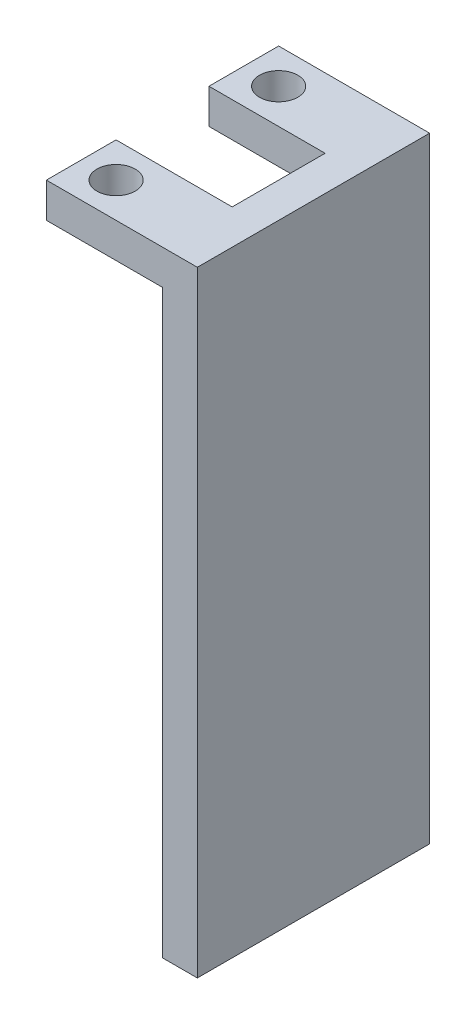
ISO-10303-21;
HEADER;
FILE_DESCRIPTION(('STEP AP214'),'2;1');
FILE_NAME('part.step','',(''),(''),'','','');
FILE_SCHEMA(('AUTOMOTIVE_DESIGN { 1 0 10303 214 1 1 1 1 }'));
ENDSEC;
DATA;
#1=APPLICATION_CONTEXT('core data for automotive mechanical design processes');
#2=APPLICATION_PROTOCOL_DEFINITION('international standard','automotive_design',2000,#1);
#3=PRODUCT_CONTEXT('',#1,'mechanical');
#4=PRODUCT('Part','Part','',(#3));
#5=PRODUCT_RELATED_PRODUCT_CATEGORY('part','',(#4));
#6=PRODUCT_DEFINITION_FORMATION('','',#4);
#7=PRODUCT_DEFINITION_CONTEXT('part definition',#1,'design');
#8=PRODUCT_DEFINITION('design','',#6,#7);
#9=PRODUCT_DEFINITION_SHAPE('','',#8);
#10=(LENGTH_UNIT() NAMED_UNIT(*) SI_UNIT(.MILLI.,.METRE.));
#11=(NAMED_UNIT(*) PLANE_ANGLE_UNIT() SI_UNIT($,.RADIAN.));
#12=(NAMED_UNIT(*) SI_UNIT($,.STERADIAN.) SOLID_ANGLE_UNIT());
#13=UNCERTAINTY_MEASURE_WITH_UNIT(LENGTH_MEASURE(1.E-05),#10,'distance_accuracy_value','');
#14=(GEOMETRIC_REPRESENTATION_CONTEXT(3) GLOBAL_UNCERTAINTY_ASSIGNED_CONTEXT((#13)) GLOBAL_UNIT_ASSIGNED_CONTEXT((#10,
#11,#12)) REPRESENTATION_CONTEXT('',''));
#15=CARTESIAN_POINT('',(0.,0.,0.));
#16=DIRECTION('',(0.,0.,1.));
#17=DIRECTION('',(1.,0.,0.));
#18=AXIS2_PLACEMENT_3D('',#15,#16,#17);
#19=CARTESIAN_POINT('',(0.,0.,0.));
#20=DIRECTION('',(1.,0.,0.));
#21=DIRECTION('',(0.,0.,-1.));
#22=AXIS2_PLACEMENT_3D('',#19,#20,#21);
#23=PLANE('',#22);
#24=DIRECTION('',(0.,-1.,0.));
#25=VECTOR('',#24,1.);
#26=CARTESIAN_POINT('',(0.,0.,4.));
#27=LINE('',#26,#25);
#28=CARTESIAN_POINT('',(0.,26.5,4.));
#29=VERTEX_POINT('',#28);
#30=CARTESIAN_POINT('',(0.,23.5,4.));
#31=VERTEX_POINT('',#30);
#32=EDGE_CURVE('E205',#29,#31,#27,.T.);
#33=ORIENTED_EDGE('',*,*,#32,.F.);
#34=DIRECTION('',(0.,0.,-1.));
#35=VECTOR('',#34,1.);
#36=CARTESIAN_POINT('',(0.,26.5,10.));
#37=LINE('',#36,#35);
#38=CARTESIAN_POINT('',(0.,26.5,-4.));
#39=VERTEX_POINT('',#38);
#40=EDGE_CURVE('E137',#29,#39,#37,.T.);
#41=ORIENTED_EDGE('',*,*,#40,.T.);
#42=DIRECTION('',(0.,-1.,0.));
#43=VECTOR('',#42,1.);
#44=CARTESIAN_POINT('',(0.,0.,-4.));
#45=LINE('',#44,#43);
#46=CARTESIAN_POINT('',(0.,23.5,-4.));
#47=VERTEX_POINT('',#46);
#48=EDGE_CURVE('E138',#39,#47,#45,.T.);
#49=ORIENTED_EDGE('',*,*,#48,.T.);
#50=DIRECTION('',(0.,0.,1.));
#51=VECTOR('',#50,1.);
#52=CARTESIAN_POINT('',(0.,23.5,0.));
#53=LINE('',#52,#51);
#54=CARTESIAN_POINT('',(0.,23.5,-10.));
#55=VERTEX_POINT('',#54);
#56=EDGE_CURVE('E140',#55,#47,#53,.T.);
#57=ORIENTED_EDGE('',*,*,#56,.F.);
#58=DIRECTION('',(0.,1.,0.));
#59=VECTOR('',#58,1.);
#60=CARTESIAN_POINT('',(0.,-26.5,-10.));
#61=LINE('',#60,#59);
#62=CARTESIAN_POINT('',(0.,-26.5,-10.));
#63=VERTEX_POINT('',#62);
#64=EDGE_CURVE('E181',#63,#55,#61,.T.);
#65=ORIENTED_EDGE('',*,*,#64,.F.);
#66=DIRECTION('',(0.,0.,-1.));
#67=VECTOR('',#66,1.);
#68=CARTESIAN_POINT('',(0.,-26.5,10.));
#69=LINE('',#68,#67);
#70=CARTESIAN_POINT('',(0.,-26.5,10.));
#71=VERTEX_POINT('',#70);
#72=EDGE_CURVE('E166',#71,#63,#69,.T.);
#73=ORIENTED_EDGE('',*,*,#72,.F.);
#74=DIRECTION('',(0.,1.,0.));
#75=VECTOR('',#74,1.);
#76=CARTESIAN_POINT('',(0.,-26.5,10.));
#77=LINE('',#76,#75);
#78=CARTESIAN_POINT('',(0.,23.5,10.));
#79=VERTEX_POINT('',#78);
#80=EDGE_CURVE('E59',#71,#79,#77,.T.);
#81=ORIENTED_EDGE('',*,*,#80,.T.);
#82=DIRECTION('',(0.,0.,1.));
#83=VECTOR('',#82,1.);
#84=CARTESIAN_POINT('',(0.,23.5,0.));
#85=LINE('',#84,#83);
#86=EDGE_CURVE('E54',#31,#79,#85,.T.);
#87=ORIENTED_EDGE('',*,*,#86,.F.);
#88=EDGE_LOOP('',(#33,#41,#49,#57,#65,#73,#81,#87));
#89=FACE_BOUND('',#88,.T.);
#90=ADVANCED_FACE('F39',(#89),#23,.F.);
#91=CARTESIAN_POINT('',(3.,-26.5,10.));
#92=DIRECTION('',(0.,1.,0.));
#93=DIRECTION('',(0.,0.,1.));
#94=AXIS2_PLACEMENT_3D('',#91,#92,#93);
#95=PLANE('',#94);
#96=ORIENTED_EDGE('',*,*,#72,.T.);
#97=DIRECTION('',(-1.,0.,0.));
#98=VECTOR('',#97,1.);
#99=CARTESIAN_POINT('',(3.,-26.5,-10.));
#100=LINE('',#99,#98);
#101=CARTESIAN_POINT('',(3.,-26.5,-10.));
#102=VERTEX_POINT('',#101);
#103=EDGE_CURVE('E11',#102,#63,#100,.T.);
#104=ORIENTED_EDGE('',*,*,#103,.F.);
#105=DIRECTION('',(0.,0.,-1.));
#106=VECTOR('',#105,1.);
#107=CARTESIAN_POINT('',(3.,-26.5,10.));
#108=LINE('',#107,#106);
#109=CARTESIAN_POINT('',(3.,-26.5,10.));
#110=VERTEX_POINT('',#109);
#111=EDGE_CURVE('E167',#110,#102,#108,.T.);
#112=ORIENTED_EDGE('',*,*,#111,.F.);
#113=DIRECTION('',(-1.,0.,0.));
#114=VECTOR('',#113,1.);
#115=CARTESIAN_POINT('',(3.,-26.5,10.));
#116=LINE('',#115,#114);
#117=EDGE_CURVE('E178',#110,#71,#116,.T.);
#118=ORIENTED_EDGE('',*,*,#117,.T.);
#119=EDGE_LOOP('',(#96,#104,#112,#118));
#120=FACE_BOUND('',#119,.T.);
#121=ADVANCED_FACE('F41',(#120),#95,.F.);
#122=CARTESIAN_POINT('',(3.,-26.5,-10.));
#123=DIRECTION('',(0.,0.,1.));
#124=DIRECTION('',(1.,0.,0.));
#125=AXIS2_PLACEMENT_3D('',#122,#123,#124);
#126=PLANE('',#125);
#127=ORIENTED_EDGE('',*,*,#64,.T.);
#128=DIRECTION('',(1.,0.,0.));
#129=VECTOR('',#128,1.);
#130=CARTESIAN_POINT('',(-10.,23.5,-10.));
#131=LINE('',#130,#129);
#132=CARTESIAN_POINT('',(-10.,23.5,-10.));
#133=VERTEX_POINT('',#132);
#134=EDGE_CURVE('E161',#133,#55,#131,.T.);
#135=ORIENTED_EDGE('',*,*,#134,.F.);
#136=DIRECTION('',(0.,-1.,0.));
#137=VECTOR('',#136,1.);
#138=CARTESIAN_POINT('',(-10.,0.,-10.));
#139=LINE('',#138,#137);
#140=CARTESIAN_POINT('',(-10.,26.5,-10.));
#141=VERTEX_POINT('',#140);
#142=EDGE_CURVE('E152',#141,#133,#139,.T.);
#143=ORIENTED_EDGE('',*,*,#142,.F.);
#144=DIRECTION('',(-1.,0.,0.));
#145=VECTOR('',#144,1.);
#146=CARTESIAN_POINT('',(3.,26.5,-10.));
#147=LINE('',#146,#145);
#148=CARTESIAN_POINT('',(3.,26.5,-10.));
#149=VERTEX_POINT('',#148);
#150=EDGE_CURVE('E47',#149,#141,#147,.T.);
#151=ORIENTED_EDGE('',*,*,#150,.F.);
#152=DIRECTION('',(0.,1.,0.));
#153=VECTOR('',#152,1.);
#154=CARTESIAN_POINT('',(3.,-26.5,-10.));
#155=LINE('',#154,#153);
#156=EDGE_CURVE('E170',#102,#149,#155,.T.);
#157=ORIENTED_EDGE('',*,*,#156,.F.);
#158=ORIENTED_EDGE('',*,*,#103,.T.);
#159=EDGE_LOOP('',(#127,#135,#143,#151,#157,#158));
#160=FACE_BOUND('',#159,.T.);
#161=ADVANCED_FACE('F197',(#160),#126,.F.);
#162=CARTESIAN_POINT('',(3.,26.5,10.));
#163=DIRECTION('',(0.,1.,0.));
#164=DIRECTION('',(0.,0.,1.));
#165=AXIS2_PLACEMENT_3D('',#162,#163,#164);
#166=PLANE('',#165);
#167=CARTESIAN_POINT('',(-7.,26.5,7.));
#168=DIRECTION('',(0.,1.,0.));
#169=DIRECTION('',(0.,0.,1.));
#170=AXIS2_PLACEMENT_3D('',#167,#168,#169);
#171=CIRCLE('',#170,1.65);
#172=CARTESIAN_POINT('',(-7.,26.5,8.65));
#173=VERTEX_POINT('',#172);
#174=EDGE_CURVE('E210',#173,#173,#171,.F.);
#175=ORIENTED_EDGE('',*,*,#174,.T.);
#176=EDGE_LOOP('',(#175));
#177=FACE_BOUND('',#176,.T.);
#178=CARTESIAN_POINT('',(-7.,26.5,-7.));
#179=DIRECTION('',(0.,1.,0.));
#180=DIRECTION('',(0.,0.,1.));
#181=AXIS2_PLACEMENT_3D('',#178,#179,#180);
#182=CIRCLE('',#181,1.65);
#183=CARTESIAN_POINT('',(-7.,26.5,-5.35));
#184=VERTEX_POINT('',#183);
#185=EDGE_CURVE('E221',#184,#184,#182,.F.);
#186=ORIENTED_EDGE('',*,*,#185,.T.);
#187=EDGE_LOOP('',(#186));
#188=FACE_BOUND('',#187,.T.);
#189=ORIENTED_EDGE('',*,*,#40,.F.);
#190=DIRECTION('',(1.,0.,0.));
#191=VECTOR('',#190,1.);
#192=CARTESIAN_POINT('',(-10.,26.5,4.));
#193=LINE('',#192,#191);
#194=CARTESIAN_POINT('',(-10.,26.5,4.));
#195=VERTEX_POINT('',#194);
#196=EDGE_CURVE('E119',#195,#29,#193,.T.);
#197=ORIENTED_EDGE('',*,*,#196,.F.);
#198=DIRECTION('',(0.,0.,-1.));
#199=VECTOR('',#198,1.);
#200=CARTESIAN_POINT('',(-10.,26.5,0.));
#201=LINE('',#200,#199);
#202=CARTESIAN_POINT('',(-10.,26.5,10.));
#203=VERTEX_POINT('',#202);
#204=EDGE_CURVE('E125',#203,#195,#201,.T.);
#205=ORIENTED_EDGE('',*,*,#204,.F.);
#206=DIRECTION('',(-1.,0.,0.));
#207=VECTOR('',#206,1.);
#208=CARTESIAN_POINT('',(3.,26.5,10.));
#209=LINE('',#208,#207);
#210=CARTESIAN_POINT('',(3.,26.5,10.));
#211=VERTEX_POINT('',#210);
#212=EDGE_CURVE('E187',#211,#203,#209,.T.);
#213=ORIENTED_EDGE('',*,*,#212,.F.);
#214=DIRECTION('',(0.,0.,-1.));
#215=VECTOR('',#214,1.);
#216=CARTESIAN_POINT('',(3.,26.5,10.));
#217=LINE('',#216,#215);
#218=EDGE_CURVE('E172',#211,#149,#217,.T.);
#219=ORIENTED_EDGE('',*,*,#218,.T.);
#220=ORIENTED_EDGE('',*,*,#150,.T.);
#221=DIRECTION('',(0.,0.,-1.));
#222=VECTOR('',#221,1.);
#223=CARTESIAN_POINT('',(-10.,26.5,0.));
#224=LINE('',#223,#222);
#225=CARTESIAN_POINT('',(-10.,26.5,-4.));
#226=VERTEX_POINT('',#225);
#227=EDGE_CURVE('E149',#226,#141,#224,.T.);
#228=ORIENTED_EDGE('',*,*,#227,.F.);
#229=DIRECTION('',(1.,0.,0.));
#230=VECTOR('',#229,1.);
#231=CARTESIAN_POINT('',(-10.,26.5,-4.));
#232=LINE('',#231,#230);
#233=EDGE_CURVE('E164',#226,#39,#232,.T.);
#234=ORIENTED_EDGE('',*,*,#233,.T.);
#235=EDGE_LOOP('',(#189,#197,#205,#213,#219,#220,#228,#234));
#236=FACE_BOUND('',#235,.T.);
#237=ADVANCED_FACE('F135',(#177,#188,#236),#166,.T.);
#238=CARTESIAN_POINT('',(3.,-26.5,10.));
#239=DIRECTION('',(0.,0.,1.));
#240=DIRECTION('',(1.,0.,0.));
#241=AXIS2_PLACEMENT_3D('',#238,#239,#240);
#242=PLANE('',#241);
#243=ORIENTED_EDGE('',*,*,#80,.F.);
#244=ORIENTED_EDGE('',*,*,#117,.F.);
#245=DIRECTION('',(0.,1.,0.));
#246=VECTOR('',#245,1.);
#247=CARTESIAN_POINT('',(3.,-26.5,10.));
#248=LINE('',#247,#246);
#249=EDGE_CURVE('E175',#110,#211,#248,.T.);
#250=ORIENTED_EDGE('',*,*,#249,.T.);
#251=ORIENTED_EDGE('',*,*,#212,.T.);
#252=DIRECTION('',(0.,1.,0.));
#253=VECTOR('',#252,1.);
#254=CARTESIAN_POINT('',(-10.,0.,10.));
#255=LINE('',#254,#253);
#256=CARTESIAN_POINT('',(-10.,23.5,10.));
#257=VERTEX_POINT('',#256);
#258=EDGE_CURVE('E131',#257,#203,#255,.T.);
#259=ORIENTED_EDGE('',*,*,#258,.F.);
#260=DIRECTION('',(1.,0.,0.));
#261=VECTOR('',#260,1.);
#262=CARTESIAN_POINT('',(-10.,23.5,10.));
#263=LINE('',#262,#261);
#264=EDGE_CURVE('E142',#257,#79,#263,.T.);
#265=ORIENTED_EDGE('',*,*,#264,.T.);
#266=EDGE_LOOP('',(#243,#244,#250,#251,#259,#265));
#267=FACE_BOUND('',#266,.T.);
#268=ADVANCED_FACE('F240',(#267),#242,.T.);
#269=CARTESIAN_POINT('',(3.,0.,0.));
#270=DIRECTION('',(1.,0.,0.));
#271=DIRECTION('',(0.,0.,-1.));
#272=AXIS2_PLACEMENT_3D('',#269,#270,#271);
#273=PLANE('',#272);
#274=ORIENTED_EDGE('',*,*,#111,.T.);
#275=ORIENTED_EDGE('',*,*,#156,.T.);
#276=ORIENTED_EDGE('',*,*,#218,.F.);
#277=ORIENTED_EDGE('',*,*,#249,.F.);
#278=EDGE_LOOP('',(#274,#275,#276,#277));
#279=FACE_BOUND('',#278,.T.);
#280=ADVANCED_FACE('F243',(#279),#273,.T.);
#281=CARTESIAN_POINT('',(-10.,0.,-4.));
#282=DIRECTION('',(0.,0.,1.));
#283=DIRECTION('',(1.,0.,0.));
#284=AXIS2_PLACEMENT_3D('',#281,#282,#283);
#285=PLANE('',#284);
#286=ORIENTED_EDGE('',*,*,#48,.F.);
#287=ORIENTED_EDGE('',*,*,#233,.F.);
#288=DIRECTION('',(0.,-1.,0.));
#289=VECTOR('',#288,1.);
#290=CARTESIAN_POINT('',(-10.,0.,-4.));
#291=LINE('',#290,#289);
#292=CARTESIAN_POINT('',(-10.,23.5,-4.));
#293=VERTEX_POINT('',#292);
#294=EDGE_CURVE('E146',#226,#293,#291,.T.);
#295=ORIENTED_EDGE('',*,*,#294,.T.);
#296=DIRECTION('',(1.,0.,0.));
#297=VECTOR('',#296,1.);
#298=CARTESIAN_POINT('',(-10.,23.5,-4.));
#299=LINE('',#298,#297);
#300=EDGE_CURVE('E155',#293,#47,#299,.T.);
#301=ORIENTED_EDGE('',*,*,#300,.T.);
#302=EDGE_LOOP('',(#286,#287,#295,#301));
#303=FACE_BOUND('',#302,.T.);
#304=ADVANCED_FACE('F204',(#303),#285,.T.);
#305=CARTESIAN_POINT('',(-10.,23.5,0.));
#306=DIRECTION('',(0.,1.,0.));
#307=DIRECTION('',(0.,0.,1.));
#308=AXIS2_PLACEMENT_3D('',#305,#306,#307);
#309=PLANE('',#308);
#310=CARTESIAN_POINT('',(-7.,23.5,-7.));
#311=DIRECTION('',(0.,-1.,0.));
#312=DIRECTION('',(0.,0.,-1.));
#313=AXIS2_PLACEMENT_3D('',#310,#311,#312);
#314=CIRCLE('',#313,1.65);
#315=CARTESIAN_POINT('',(-7.,23.5,-8.65));
#316=VERTEX_POINT('',#315);
#317=EDGE_CURVE('E218',#316,#316,#314,.T.);
#318=ORIENTED_EDGE('',*,*,#317,.F.);
#319=EDGE_LOOP('',(#318));
#320=FACE_BOUND('',#319,.T.);
#321=ORIENTED_EDGE('',*,*,#56,.T.);
#322=ORIENTED_EDGE('',*,*,#300,.F.);
#323=DIRECTION('',(0.,0.,1.));
#324=VECTOR('',#323,1.);
#325=CARTESIAN_POINT('',(-10.,23.5,0.));
#326=LINE('',#325,#324);
#327=EDGE_CURVE('E154',#133,#293,#326,.T.);
#328=ORIENTED_EDGE('',*,*,#327,.F.);
#329=ORIENTED_EDGE('',*,*,#134,.T.);
#330=EDGE_LOOP('',(#321,#322,#328,#329));
#331=FACE_BOUND('',#330,.T.);
#332=ADVANCED_FACE('F201',(#320,#331),#309,.F.);
#333=CARTESIAN_POINT('',(-10.,0.,0.));
#334=DIRECTION('',(-1.,0.,0.));
#335=DIRECTION('',(0.,0.,1.));
#336=AXIS2_PLACEMENT_3D('',#333,#334,#335);
#337=PLANE('',#336);
#338=ORIENTED_EDGE('',*,*,#294,.F.);
#339=ORIENTED_EDGE('',*,*,#227,.T.);
#340=ORIENTED_EDGE('',*,*,#142,.T.);
#341=ORIENTED_EDGE('',*,*,#327,.T.);
#342=EDGE_LOOP('',(#338,#339,#340,#341));
#343=FACE_BOUND('',#342,.T.);
#344=ADVANCED_FACE('F195',(#343),#337,.T.);
#345=CARTESIAN_POINT('',(-10.,0.,4.));
#346=DIRECTION('',(0.,0.,1.));
#347=DIRECTION('',(1.,0.,0.));
#348=AXIS2_PLACEMENT_3D('',#345,#346,#347);
#349=PLANE('',#348);
#350=ORIENTED_EDGE('',*,*,#32,.T.);
#351=DIRECTION('',(1.,0.,0.));
#352=VECTOR('',#351,1.);
#353=CARTESIAN_POINT('',(-10.,23.5,4.));
#354=LINE('',#353,#352);
#355=CARTESIAN_POINT('',(-10.,23.5,4.));
#356=VERTEX_POINT('',#355);
#357=EDGE_CURVE('E121',#356,#31,#354,.T.);
#358=ORIENTED_EDGE('',*,*,#357,.F.);
#359=DIRECTION('',(0.,-1.,0.));
#360=VECTOR('',#359,1.);
#361=CARTESIAN_POINT('',(-10.,0.,4.));
#362=LINE('',#361,#360);
#363=EDGE_CURVE('E115',#195,#356,#362,.T.);
#364=ORIENTED_EDGE('',*,*,#363,.F.);
#365=ORIENTED_EDGE('',*,*,#196,.T.);
#366=EDGE_LOOP('',(#350,#358,#364,#365));
#367=FACE_BOUND('',#366,.T.);
#368=ADVANCED_FACE('F117',(#367),#349,.F.);
#369=CARTESIAN_POINT('',(-10.,23.5,0.));
#370=DIRECTION('',(0.,1.,0.));
#371=DIRECTION('',(0.,0.,1.));
#372=AXIS2_PLACEMENT_3D('',#369,#370,#371);
#373=PLANE('',#372);
#374=CARTESIAN_POINT('',(-7.,23.5,7.));
#375=DIRECTION('',(0.,-1.,0.));
#376=DIRECTION('',(0.,0.,-1.));
#377=AXIS2_PLACEMENT_3D('',#374,#375,#376);
#378=CIRCLE('',#377,1.65);
#379=CARTESIAN_POINT('',(-7.,23.5,5.35));
#380=VERTEX_POINT('',#379);
#381=EDGE_CURVE('E206',#380,#380,#378,.T.);
#382=ORIENTED_EDGE('',*,*,#381,.F.);
#383=EDGE_LOOP('',(#382));
#384=FACE_BOUND('',#383,.T.);
#385=ORIENTED_EDGE('',*,*,#86,.T.);
#386=ORIENTED_EDGE('',*,*,#264,.F.);
#387=DIRECTION('',(0.,0.,1.));
#388=VECTOR('',#387,1.);
#389=CARTESIAN_POINT('',(-10.,23.5,0.));
#390=LINE('',#389,#388);
#391=EDGE_CURVE('E124',#356,#257,#390,.T.);
#392=ORIENTED_EDGE('',*,*,#391,.F.);
#393=ORIENTED_EDGE('',*,*,#357,.T.);
#394=EDGE_LOOP('',(#385,#386,#392,#393));
#395=FACE_BOUND('',#394,.T.);
#396=ADVANCED_FACE('F236',(#384,#395),#373,.F.);
#397=CARTESIAN_POINT('',(-10.,0.,0.));
#398=DIRECTION('',(-1.,0.,0.));
#399=DIRECTION('',(0.,0.,1.));
#400=AXIS2_PLACEMENT_3D('',#397,#398,#399);
#401=PLANE('',#400);
#402=ORIENTED_EDGE('',*,*,#204,.T.);
#403=ORIENTED_EDGE('',*,*,#363,.T.);
#404=ORIENTED_EDGE('',*,*,#391,.T.);
#405=ORIENTED_EDGE('',*,*,#258,.T.);
#406=EDGE_LOOP('',(#402,#403,#404,#405));
#407=FACE_BOUND('',#406,.T.);
#408=ADVANCED_FACE('F129',(#407),#401,.T.);
#409=CARTESIAN_POINT('',(-7.,26.501,7.));
#410=DIRECTION('',(0.,-1.,0.));
#411=DIRECTION('',(0.,0.,-1.));
#412=AXIS2_PLACEMENT_3D('',#409,#410,#411);
#413=CYLINDRICAL_SURFACE('',#412,1.65);
#414=ORIENTED_EDGE('',*,*,#174,.F.);
#415=EDGE_LOOP('',(#414));
#416=FACE_BOUND('',#415,.T.);
#417=ORIENTED_EDGE('',*,*,#381,.T.);
#418=EDGE_LOOP('',(#417));
#419=FACE_BOUND('',#418,.T.);
#420=ADVANCED_FACE('F229',(#416,#419),#413,.F.);
#421=CARTESIAN_POINT('',(-7.,26.501,-7.));
#422=DIRECTION('',(0.,-1.,0.));
#423=DIRECTION('',(0.,0.,-1.));
#424=AXIS2_PLACEMENT_3D('',#421,#422,#423);
#425=CYLINDRICAL_SURFACE('',#424,1.65);
#426=ORIENTED_EDGE('',*,*,#185,.F.);
#427=EDGE_LOOP('',(#426));
#428=FACE_BOUND('',#427,.T.);
#429=ORIENTED_EDGE('',*,*,#317,.T.);
#430=EDGE_LOOP('',(#429));
#431=FACE_BOUND('',#430,.T.);
#432=ADVANCED_FACE('F232',(#428,#431),#425,.F.);
#433=CLOSED_SHELL('',(#90,#121,#161,#237,#268,#280,#304,#332,#344,#368,#396,#408,#420,#432));
#434=MANIFOLD_SOLID_BREP('B2',#433);
#435=ADVANCED_BREP_SHAPE_REPRESENTATION('',(#18,#434),#14);
#436=SHAPE_DEFINITION_REPRESENTATION(#9,#435);
ENDSEC;
END-ISO-10303-21;
